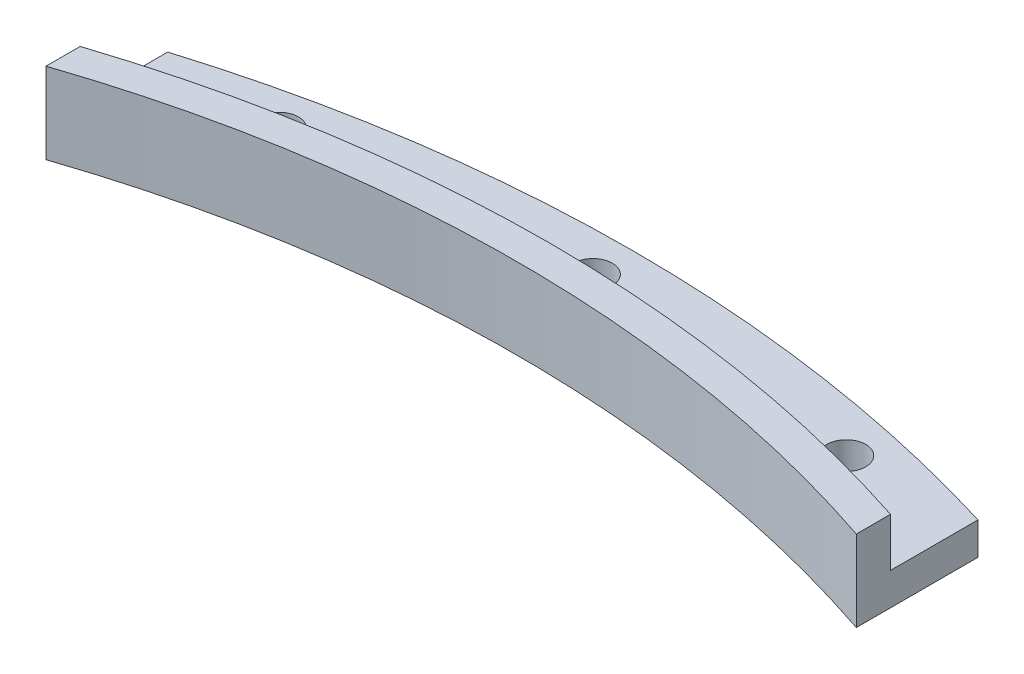
ISO-10303-21;
HEADER;
FILE_DESCRIPTION(('STEP AP214'),'2;1');
FILE_NAME('part.step','',(''),(''),'','','');
FILE_SCHEMA(('AUTOMOTIVE_DESIGN { 1 0 10303 214 1 1 1 1 }'));
ENDSEC;
DATA;
#1=APPLICATION_CONTEXT('core data for automotive mechanical design processes');
#2=APPLICATION_PROTOCOL_DEFINITION('international standard','automotive_design',2000,#1);
#3=PRODUCT_CONTEXT('',#1,'mechanical');
#4=PRODUCT('Part','Part','',(#3));
#5=PRODUCT_RELATED_PRODUCT_CATEGORY('part','',(#4));
#6=PRODUCT_DEFINITION_FORMATION('','',#4);
#7=PRODUCT_DEFINITION_CONTEXT('part definition',#1,'design');
#8=PRODUCT_DEFINITION('design','',#6,#7);
#9=PRODUCT_DEFINITION_SHAPE('','',#8);
#10=(LENGTH_UNIT() NAMED_UNIT(*) SI_UNIT(.MILLI.,.METRE.));
#11=(NAMED_UNIT(*) PLANE_ANGLE_UNIT() SI_UNIT($,.RADIAN.));
#12=(NAMED_UNIT(*) SI_UNIT($,.STERADIAN.) SOLID_ANGLE_UNIT());
#13=UNCERTAINTY_MEASURE_WITH_UNIT(LENGTH_MEASURE(1.E-05),#10,'distance_accuracy_value','');
#14=(GEOMETRIC_REPRESENTATION_CONTEXT(3) GLOBAL_UNCERTAINTY_ASSIGNED_CONTEXT((#13)) GLOBAL_UNIT_ASSIGNED_CONTEXT((#10,
#11,#12)) REPRESENTATION_CONTEXT('',''));
#15=CARTESIAN_POINT('',(0.,0.,0.));
#16=DIRECTION('',(0.,0.,1.));
#17=DIRECTION('',(1.,0.,0.));
#18=AXIS2_PLACEMENT_3D('',#15,#16,#17);
#19=CARTESIAN_POINT('',(0.,2.,0.));
#20=DIRECTION('',(-1.,0.,0.));
#21=DIRECTION('',(0.,0.,1.));
#22=AXIS2_PLACEMENT_3D('',#19,#20,#21);
#23=PLANE('',#22);
#24=DIRECTION('',(0.,0.,-1.));
#25=VECTOR('',#24,1.);
#26=CARTESIAN_POINT('',(0.,0.,0.));
#27=LINE('',#26,#25);
#28=CARTESIAN_POINT('',(0.,0.,2.10690480204681));
#29=VERTEX_POINT('',#28);
#30=CARTESIAN_POINT('',(0.,0.,-5.4));
#31=VERTEX_POINT('',#30);
#32=EDGE_CURVE('E69',#29,#31,#27,.T.);
#33=ORIENTED_EDGE('',*,*,#32,.T.);
#34=DIRECTION('',(0.,-1.,0.));
#35=VECTOR('',#34,1.);
#36=CARTESIAN_POINT('',(0.,2.,-5.4));
#37=LINE('',#36,#35);
#38=CARTESIAN_POINT('',(0.,2.,-5.4));
#39=VERTEX_POINT('',#38);
#40=EDGE_CURVE('E11',#39,#31,#37,.T.);
#41=ORIENTED_EDGE('',*,*,#40,.F.);
#42=DIRECTION('',(0.,0.,-1.));
#43=VECTOR('',#42,1.);
#44=CARTESIAN_POINT('',(0.,2.,0.));
#45=LINE('',#44,#43);
#46=CARTESIAN_POINT('',(0.,2.,0.));
#47=VERTEX_POINT('',#46);
#48=EDGE_CURVE('E149',#47,#39,#45,.T.);
#49=ORIENTED_EDGE('',*,*,#48,.F.);
#50=DIRECTION('',(0.,-1.,0.));
#51=VECTOR('',#50,1.);
#52=CARTESIAN_POINT('',(0.,5.,0.));
#53=LINE('',#52,#51);
#54=CARTESIAN_POINT('',(0.,5.,0.));
#55=VERTEX_POINT('',#54);
#56=EDGE_CURVE('E77',#55,#47,#53,.T.);
#57=ORIENTED_EDGE('',*,*,#56,.F.);
#58=DIRECTION('',(0.,0.,-1.));
#59=VECTOR('',#58,1.);
#60=CARTESIAN_POINT('',(0.,5.,0.));
#61=LINE('',#60,#59);
#62=CARTESIAN_POINT('',(0.,5.,2.10690480204681));
#63=VERTEX_POINT('',#62);
#64=EDGE_CURVE('E121',#63,#55,#61,.T.);
#65=ORIENTED_EDGE('',*,*,#64,.F.);
#66=DIRECTION('',(0.,-1.,0.));
#67=VECTOR('',#66,1.);
#68=CARTESIAN_POINT('',(0.,5.,2.10690480204681));
#69=LINE('',#68,#67);
#70=EDGE_CURVE('E113',#63,#29,#69,.T.);
#71=ORIENTED_EDGE('',*,*,#70,.T.);
#72=EDGE_LOOP('',(#33,#41,#49,#57,#65,#71));
#73=FACE_BOUND('',#72,.T.);
#74=ADVANCED_FACE('F41',(#73),#23,.F.);
#75=CARTESIAN_POINT('',(-25.0000000000009,2.,76.3633781102516));
#76=DIRECTION('',(0.,-1.,0.));
#77=DIRECTION('',(0.,0.,-1.));
#78=AXIS2_PLACEMENT_3D('',#75,#76,#77);
#79=CYLINDRICAL_SURFACE('',#78,85.5000000000001);
#80=CARTESIAN_POINT('',(-25.0000000000009,0.,76.3633781102516));
#81=DIRECTION('',(0.,1.,0.));
#82=DIRECTION('',(0.,0.,1.));
#83=AXIS2_PLACEMENT_3D('',#80,#81,#82);
#84=CIRCLE('',#83,85.5000000000001);
#85=CARTESIAN_POINT('',(-50.0000000000018,0.,-5.4));
#86=VERTEX_POINT('',#85);
#87=EDGE_CURVE('E159',#31,#86,#84,.T.);
#88=ORIENTED_EDGE('',*,*,#87,.T.);
#89=DIRECTION('',(0.,-1.,0.));
#90=VECTOR('',#89,1.);
#91=CARTESIAN_POINT('',(-50.0000000000018,2.,-5.4));
#92=LINE('',#91,#90);
#93=CARTESIAN_POINT('',(-50.0000000000018,2.,-5.4));
#94=VERTEX_POINT('',#93);
#95=EDGE_CURVE('E50',#94,#86,#92,.T.);
#96=ORIENTED_EDGE('',*,*,#95,.F.);
#97=CARTESIAN_POINT('',(-25.0000000000009,2.,76.3633781102516));
#98=DIRECTION('',(0.,1.,0.));
#99=DIRECTION('',(0.,0.,1.));
#100=AXIS2_PLACEMENT_3D('',#97,#98,#99);
#101=CIRCLE('',#100,85.5000000000001);
#102=EDGE_CURVE('E58',#39,#94,#101,.T.);
#103=ORIENTED_EDGE('',*,*,#102,.F.);
#104=ORIENTED_EDGE('',*,*,#40,.T.);
#105=EDGE_LOOP('',(#88,#96,#103,#104));
#106=FACE_BOUND('',#105,.T.);
#107=ADVANCED_FACE('F172',(#106),#79,.T.);
#108=CARTESIAN_POINT('',(-50.0000000000018,2.,0.));
#109=DIRECTION('',(1.,0.,0.));
#110=DIRECTION('',(0.,0.,-1.));
#111=AXIS2_PLACEMENT_3D('',#108,#109,#110);
#112=PLANE('',#111);
#113=DIRECTION('',(0.,0.,1.));
#114=VECTOR('',#113,1.);
#115=CARTESIAN_POINT('',(-50.0000000000018,0.,0.));
#116=LINE('',#115,#114);
#117=CARTESIAN_POINT('',(-50.0000000000017,0.,2.10690480204681));
#118=VERTEX_POINT('',#117);
#119=EDGE_CURVE('E108',#86,#118,#116,.T.);
#120=ORIENTED_EDGE('',*,*,#119,.T.);
#121=DIRECTION('',(0.,-1.,0.));
#122=VECTOR('',#121,1.);
#123=CARTESIAN_POINT('',(-50.0000000000017,5.,2.10690480204681));
#124=LINE('',#123,#122);
#125=CARTESIAN_POINT('',(-50.0000000000017,5.,2.10690480204681));
#126=VERTEX_POINT('',#125);
#127=EDGE_CURVE('E100',#126,#118,#124,.T.);
#128=ORIENTED_EDGE('',*,*,#127,.F.);
#129=DIRECTION('',(0.,0.,-1.));
#130=VECTOR('',#129,1.);
#131=CARTESIAN_POINT('',(-50.0000000000018,5.,1.64670323432898E-13));
#132=LINE('',#131,#130);
#133=CARTESIAN_POINT('',(-50.0000000000018,5.,0.));
#134=VERTEX_POINT('',#133);
#135=EDGE_CURVE('E105',#126,#134,#132,.T.);
#136=ORIENTED_EDGE('',*,*,#135,.T.);
#137=DIRECTION('',(0.,-1.,0.));
#138=VECTOR('',#137,1.);
#139=CARTESIAN_POINT('',(-50.0000000000018,5.,0.));
#140=LINE('',#139,#138);
#141=CARTESIAN_POINT('',(-50.0000000000018,2.,0.));
#142=VERTEX_POINT('',#141);
#143=EDGE_CURVE('E138',#134,#142,#140,.T.);
#144=ORIENTED_EDGE('',*,*,#143,.T.);
#145=DIRECTION('',(0.,0.,1.));
#146=VECTOR('',#145,1.);
#147=CARTESIAN_POINT('',(-50.0000000000018,2.,0.));
#148=LINE('',#147,#146);
#149=EDGE_CURVE('E154',#94,#142,#148,.T.);
#150=ORIENTED_EDGE('',*,*,#149,.F.);
#151=ORIENTED_EDGE('',*,*,#95,.T.);
#152=EDGE_LOOP('',(#120,#128,#136,#144,#150,#151));
#153=FACE_BOUND('',#152,.T.);
#154=ADVANCED_FACE('F102',(#153),#112,.F.);
#155=CARTESIAN_POINT('',(0.,2.,0.));
#156=DIRECTION('',(0.,1.,0.));
#157=DIRECTION('',(0.,0.,1.));
#158=AXIS2_PLACEMENT_3D('',#155,#156,#157);
#159=PLANE('',#158);
#160=CARTESIAN_POINT('',(-42.5000000000009,2.,-4.77077006423787));
#161=DIRECTION('',(0.,1.,0.));
#162=DIRECTION('',(0.,0.,1.));
#163=AXIS2_PLACEMENT_3D('',#160,#161,#162);
#164=CIRCLE('',#163,1.19999999999999);
#165=CARTESIAN_POINT('',(-42.5000000000009,2.,-3.57077006423788));
#166=VERTEX_POINT('',#165);
#167=EDGE_CURVE('E211',#166,#166,#164,.T.);
#168=ORIENTED_EDGE('',*,*,#167,.F.);
#169=EDGE_LOOP('',(#168));
#170=FACE_BOUND('',#169,.T.);
#171=CARTESIAN_POINT('',(-25.0000000000009,2.,-6.63662188974848));
#172=DIRECTION('',(0.,1.,0.));
#173=DIRECTION('',(0.,0.,1.));
#174=AXIS2_PLACEMENT_3D('',#171,#172,#173);
#175=CIRCLE('',#174,1.19999999999999);
#176=CARTESIAN_POINT('',(-25.0000000000009,2.,-5.43662188974848));
#177=VERTEX_POINT('',#176);
#178=EDGE_CURVE('E218',#177,#177,#175,.T.);
#179=ORIENTED_EDGE('',*,*,#178,.F.);
#180=EDGE_LOOP('',(#179));
#181=FACE_BOUND('',#180,.T.);
#182=CARTESIAN_POINT('',(-7.50000000000088,2.,-4.77077006423787));
#183=DIRECTION('',(0.,1.,0.));
#184=DIRECTION('',(0.,0.,1.));
#185=AXIS2_PLACEMENT_3D('',#182,#183,#184);
#186=CIRCLE('',#185,1.19999999999999);
#187=CARTESIAN_POINT('',(-7.50000000000088,2.,-3.57077006423788));
#188=VERTEX_POINT('',#187);
#189=EDGE_CURVE('E130',#188,#188,#186,.T.);
#190=ORIENTED_EDGE('',*,*,#189,.F.);
#191=EDGE_LOOP('',(#190));
#192=FACE_BOUND('',#191,.T.);
#193=CARTESIAN_POINT('',(-25.,2.,76.5196053309217));
#194=DIRECTION('',(0.,1.,0.));
#195=DIRECTION('',(0.,0.,1.));
#196=AXIS2_PLACEMENT_3D('',#193,#194,#195);
#197=CIRCLE('',#196,80.5000000000004);
#198=EDGE_CURVE('E146',#47,#142,#197,.T.);
#199=ORIENTED_EDGE('',*,*,#198,.F.);
#200=ORIENTED_EDGE('',*,*,#48,.T.);
#201=ORIENTED_EDGE('',*,*,#102,.T.);
#202=ORIENTED_EDGE('',*,*,#149,.T.);
#203=EDGE_LOOP('',(#199,#200,#201,#202));
#204=FACE_BOUND('',#203,.T.);
#205=ADVANCED_FACE('F171',(#170,#181,#192,#204),#159,.T.);
#206=CARTESIAN_POINT('',(0.,0.,0.));
#207=DIRECTION('',(0.,1.,0.));
#208=DIRECTION('',(0.,0.,1.));
#209=AXIS2_PLACEMENT_3D('',#206,#207,#208);
#210=PLANE('',#209);
#211=CARTESIAN_POINT('',(-42.5000000000009,0.,-4.77077006423787));
#212=DIRECTION('',(0.,-1.,0.));
#213=DIRECTION('',(0.,0.,-1.));
#214=AXIS2_PLACEMENT_3D('',#211,#212,#213);
#215=CIRCLE('',#214,1.19999999999999);
#216=CARTESIAN_POINT('',(-42.5000000000009,0.,-5.97077006423786));
#217=VERTEX_POINT('',#216);
#218=EDGE_CURVE('E208',#217,#217,#215,.T.);
#219=ORIENTED_EDGE('',*,*,#218,.F.);
#220=EDGE_LOOP('',(#219));
#221=FACE_BOUND('',#220,.T.);
#222=CARTESIAN_POINT('',(-25.0000000000009,0.,-6.63662188974848));
#223=DIRECTION('',(0.,-1.,0.));
#224=DIRECTION('',(0.,0.,-1.));
#225=AXIS2_PLACEMENT_3D('',#222,#223,#224);
#226=CIRCLE('',#225,1.19999999999999);
#227=CARTESIAN_POINT('',(-25.0000000000009,0.,-7.83662188974847));
#228=VERTEX_POINT('',#227);
#229=EDGE_CURVE('E213',#228,#228,#226,.T.);
#230=ORIENTED_EDGE('',*,*,#229,.F.);
#231=EDGE_LOOP('',(#230));
#232=FACE_BOUND('',#231,.T.);
#233=CARTESIAN_POINT('',(-7.50000000000088,0.,-4.77077006423787));
#234=DIRECTION('',(0.,-1.,0.));
#235=DIRECTION('',(0.,0.,-1.));
#236=AXIS2_PLACEMENT_3D('',#233,#234,#235);
#237=CIRCLE('',#236,1.19999999999999);
#238=CARTESIAN_POINT('',(-7.50000000000088,0.,-5.97077006423786));
#239=VERTEX_POINT('',#238);
#240=EDGE_CURVE('E224',#239,#239,#237,.T.);
#241=ORIENTED_EDGE('',*,*,#240,.F.);
#242=EDGE_LOOP('',(#241));
#243=FACE_BOUND('',#242,.T.);
#244=ORIENTED_EDGE('',*,*,#32,.F.);
#245=CARTESIAN_POINT('',(-25.,0.,76.5196053309217));
#246=DIRECTION('',(0.,1.,0.));
#247=DIRECTION('',(0.,0.,1.));
#248=AXIS2_PLACEMENT_3D('',#245,#246,#247);
#249=CIRCLE('',#248,78.5000000000004);
#250=EDGE_CURVE('E127',#118,#29,#249,.F.);
#251=ORIENTED_EDGE('',*,*,#250,.F.);
#252=ORIENTED_EDGE('',*,*,#119,.F.);
#253=ORIENTED_EDGE('',*,*,#87,.F.);
#254=EDGE_LOOP('',(#244,#251,#252,#253));
#255=FACE_BOUND('',#254,.T.);
#256=ADVANCED_FACE('F168',(#221,#232,#243,#255),#210,.F.);
#257=CARTESIAN_POINT('',(-25.,5.,76.5196053309217));
#258=DIRECTION('',(0.,-1.,0.));
#259=DIRECTION('',(0.,0.,-1.));
#260=AXIS2_PLACEMENT_3D('',#257,#258,#259);
#261=CYLINDRICAL_SURFACE('',#260,78.5000000000004);
#262=ORIENTED_EDGE('',*,*,#250,.T.);
#263=ORIENTED_EDGE('',*,*,#70,.F.);
#264=CARTESIAN_POINT('',(-25.,5.,76.5196053309217));
#265=DIRECTION('',(0.,1.,0.));
#266=DIRECTION('',(0.,0.,1.));
#267=AXIS2_PLACEMENT_3D('',#264,#265,#266);
#268=CIRCLE('',#267,78.5000000000004);
#269=EDGE_CURVE('E116',#126,#63,#268,.F.);
#270=ORIENTED_EDGE('',*,*,#269,.F.);
#271=ORIENTED_EDGE('',*,*,#127,.T.);
#272=EDGE_LOOP('',(#262,#263,#270,#271));
#273=FACE_BOUND('',#272,.T.);
#274=ADVANCED_FACE('F117',(#273),#261,.F.);
#275=CARTESIAN_POINT('',(-25.,5.,76.5196053309217));
#276=DIRECTION('',(0.,-1.,0.));
#277=DIRECTION('',(0.,0.,-1.));
#278=AXIS2_PLACEMENT_3D('',#275,#276,#277);
#279=CYLINDRICAL_SURFACE('',#278,80.5000000000004);
#280=ORIENTED_EDGE('',*,*,#198,.T.);
#281=ORIENTED_EDGE('',*,*,#143,.F.);
#282=CARTESIAN_POINT('',(-25.,5.,76.5196053309217));
#283=DIRECTION('',(0.,1.,0.));
#284=DIRECTION('',(0.,0.,1.));
#285=AXIS2_PLACEMENT_3D('',#282,#283,#284);
#286=CIRCLE('',#285,80.5000000000004);
#287=EDGE_CURVE('E124',#55,#134,#286,.T.);
#288=ORIENTED_EDGE('',*,*,#287,.F.);
#289=ORIENTED_EDGE('',*,*,#56,.T.);
#290=EDGE_LOOP('',(#280,#281,#288,#289));
#291=FACE_BOUND('',#290,.T.);
#292=ADVANCED_FACE('F170',(#291),#279,.T.);
#293=CARTESIAN_POINT('',(0.,5.,0.));
#294=DIRECTION('',(0.,1.,0.));
#295=DIRECTION('',(0.,0.,1.));
#296=AXIS2_PLACEMENT_3D('',#293,#294,#295);
#297=PLANE('',#296);
#298=ORIENTED_EDGE('',*,*,#135,.F.);
#299=ORIENTED_EDGE('',*,*,#269,.T.);
#300=ORIENTED_EDGE('',*,*,#64,.T.);
#301=ORIENTED_EDGE('',*,*,#287,.T.);
#302=EDGE_LOOP('',(#298,#299,#300,#301));
#303=FACE_BOUND('',#302,.T.);
#304=ADVANCED_FACE('F123',(#303),#297,.T.);
#305=CARTESIAN_POINT('',(-7.50000000000088,0.,-4.77077006423787));
#306=DIRECTION('',(0.,-1.,0.));
#307=DIRECTION('',(0.,0.,-1.));
#308=AXIS2_PLACEMENT_3D('',#305,#306,#307);
#309=CYLINDRICAL_SURFACE('',#308,1.19999999999999);
#310=ORIENTED_EDGE('',*,*,#240,.T.);
#311=EDGE_LOOP('',(#310));
#312=FACE_BOUND('',#311,.T.);
#313=ORIENTED_EDGE('',*,*,#189,.T.);
#314=EDGE_LOOP('',(#313));
#315=FACE_BOUND('',#314,.T.);
#316=ADVANCED_FACE('F192',(#312,#315),#309,.F.);
#317=CARTESIAN_POINT('',(-25.0000000000009,0.,-6.63662188974848));
#318=DIRECTION('',(0.,-1.,0.));
#319=DIRECTION('',(0.,0.,-1.));
#320=AXIS2_PLACEMENT_3D('',#317,#318,#319);
#321=CYLINDRICAL_SURFACE('',#320,1.19999999999999);
#322=ORIENTED_EDGE('',*,*,#229,.T.);
#323=EDGE_LOOP('',(#322));
#324=FACE_BOUND('',#323,.T.);
#325=ORIENTED_EDGE('',*,*,#178,.T.);
#326=EDGE_LOOP('',(#325));
#327=FACE_BOUND('',#326,.T.);
#328=ADVANCED_FACE('F195',(#324,#327),#321,.F.);
#329=CARTESIAN_POINT('',(-42.5000000000009,0.,-4.77077006423787));
#330=DIRECTION('',(0.,-1.,0.));
#331=DIRECTION('',(0.,0.,-1.));
#332=AXIS2_PLACEMENT_3D('',#329,#330,#331);
#333=CYLINDRICAL_SURFACE('',#332,1.19999999999999);
#334=ORIENTED_EDGE('',*,*,#218,.T.);
#335=EDGE_LOOP('',(#334));
#336=FACE_BOUND('',#335,.T.);
#337=ORIENTED_EDGE('',*,*,#167,.T.);
#338=EDGE_LOOP('',(#337));
#339=FACE_BOUND('',#338,.T.);
#340=ADVANCED_FACE('F199',(#336,#339),#333,.F.);
#341=CLOSED_SHELL('',(#74,#107,#154,#205,#256,#274,#292,#304,#316,#328,#340));
#342=MANIFOLD_SOLID_BREP('B2',#341);
#343=ADVANCED_BREP_SHAPE_REPRESENTATION('',(#18,#342),#14);
#344=SHAPE_DEFINITION_REPRESENTATION(#9,#343);
ENDSEC;
END-ISO-10303-21;
